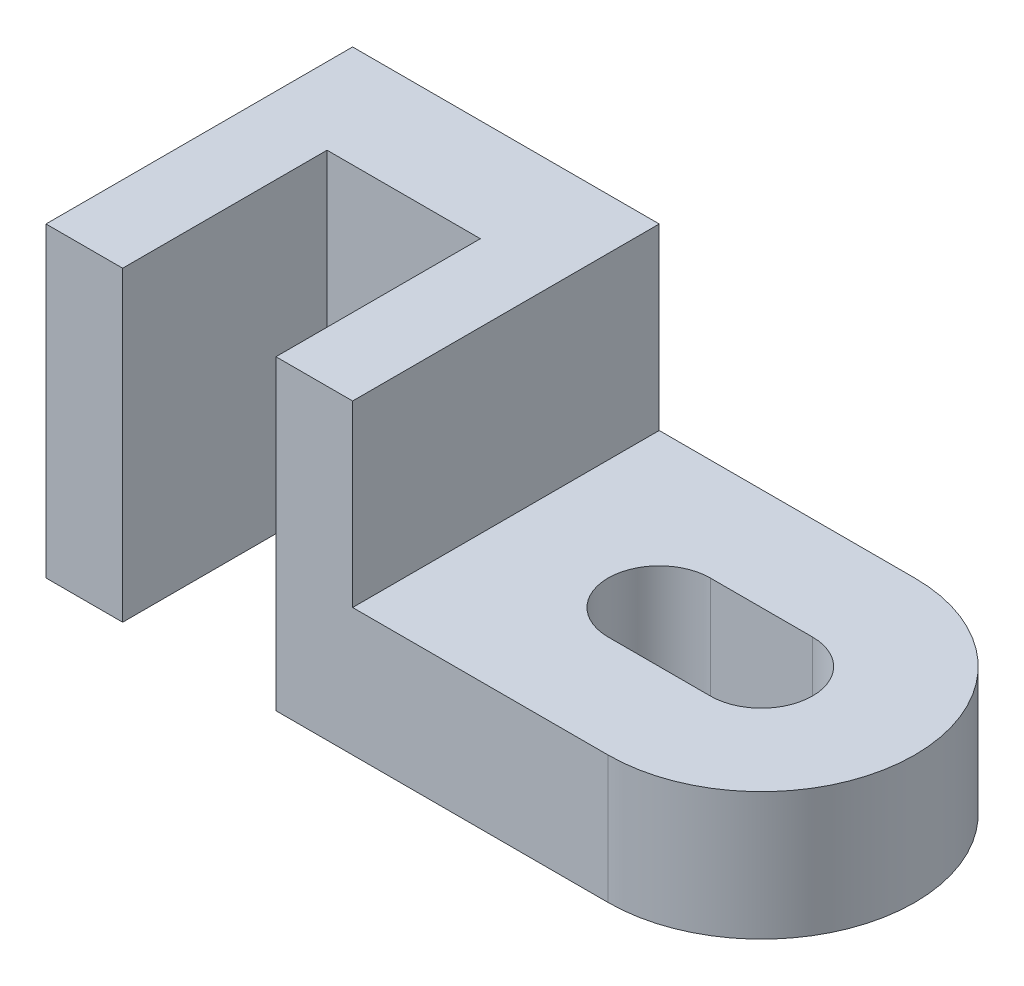
ISO-10303-21;
HEADER;
FILE_DESCRIPTION(('STEP AP214'),'2;1');
FILE_NAME('part.step','',(''),(''),'','','');
FILE_SCHEMA(('AUTOMOTIVE_DESIGN { 1 0 10303 214 1 1 1 1 }'));
ENDSEC;
DATA;
#1=APPLICATION_CONTEXT('core data for automotive mechanical design processes');
#2=APPLICATION_PROTOCOL_DEFINITION('international standard','automotive_design',2000,#1);
#3=PRODUCT_CONTEXT('',#1,'mechanical');
#4=PRODUCT('Part','Part','',(#3));
#5=PRODUCT_RELATED_PRODUCT_CATEGORY('part','',(#4));
#6=PRODUCT_DEFINITION_FORMATION('','',#4);
#7=PRODUCT_DEFINITION_CONTEXT('part definition',#1,'design');
#8=PRODUCT_DEFINITION('design','',#6,#7);
#9=PRODUCT_DEFINITION_SHAPE('','',#8);
#10=(LENGTH_UNIT() NAMED_UNIT(*) SI_UNIT(.MILLI.,.METRE.));
#11=(NAMED_UNIT(*) PLANE_ANGLE_UNIT() SI_UNIT($,.RADIAN.));
#12=(NAMED_UNIT(*) SI_UNIT($,.STERADIAN.) SOLID_ANGLE_UNIT());
#13=UNCERTAINTY_MEASURE_WITH_UNIT(LENGTH_MEASURE(1.E-05),#10,'distance_accuracy_value','');
#14=(GEOMETRIC_REPRESENTATION_CONTEXT(3) GLOBAL_UNCERTAINTY_ASSIGNED_CONTEXT((#13)) GLOBAL_UNIT_ASSIGNED_CONTEXT((#10,
#11,#12)) REPRESENTATION_CONTEXT('',''));
#15=CARTESIAN_POINT('',(0.,0.,0.));
#16=DIRECTION('',(0.,0.,1.));
#17=DIRECTION('',(1.,0.,0.));
#18=AXIS2_PLACEMENT_3D('',#15,#16,#17);
#19=CARTESIAN_POINT('',(0.,24.,-12.));
#20=DIRECTION('',(0.,0.,-1.));
#21=DIRECTION('',(-1.,0.,0.));
#22=AXIS2_PLACEMENT_3D('',#19,#20,#21);
#23=PLANE('',#22);
#24=DIRECTION('',(1.,0.,0.));
#25=VECTOR('',#24,1.);
#26=CARTESIAN_POINT('',(0.,0.,-12.));
#27=LINE('',#26,#25);
#28=CARTESIAN_POINT('',(-24.,0.,-12.));
#29=VERTEX_POINT('',#28);
#30=CARTESIAN_POINT('',(20.,0.,-12.));
#31=VERTEX_POINT('',#30);
#32=EDGE_CURVE('E136',#29,#31,#27,.T.);
#33=ORIENTED_EDGE('',*,*,#32,.F.);
#34=DIRECTION('',(0.,-1.,0.));
#35=VECTOR('',#34,1.);
#36=CARTESIAN_POINT('',(-24.,24.,-12.));
#37=LINE('',#36,#35);
#38=CARTESIAN_POINT('',(-24.,24.,-12.));
#39=VERTEX_POINT('',#38);
#40=EDGE_CURVE('E11',#39,#29,#37,.T.);
#41=ORIENTED_EDGE('',*,*,#40,.F.);
#42=DIRECTION('',(1.,0.,0.));
#43=VECTOR('',#42,1.);
#44=CARTESIAN_POINT('',(0.,24.,-12.));
#45=LINE('',#44,#43);
#46=CARTESIAN_POINT('',(0.,24.,-12.));
#47=VERTEX_POINT('',#46);
#48=EDGE_CURVE('E155',#39,#47,#45,.T.);
#49=ORIENTED_EDGE('',*,*,#48,.T.);
#50=DIRECTION('',(0.,-1.,0.));
#51=VECTOR('',#50,1.);
#52=CARTESIAN_POINT('',(0.,24.,-12.));
#53=LINE('',#52,#51);
#54=CARTESIAN_POINT('',(0.,10.,-12.));
#55=VERTEX_POINT('',#54);
#56=EDGE_CURVE('E58',#47,#55,#53,.T.);
#57=ORIENTED_EDGE('',*,*,#56,.T.);
#58=DIRECTION('',(1.,0.,0.));
#59=VECTOR('',#58,1.);
#60=CARTESIAN_POINT('',(0.,10.,-12.));
#61=LINE('',#60,#59);
#62=CARTESIAN_POINT('',(20.,10.,-12.));
#63=VERTEX_POINT('',#62);
#64=EDGE_CURVE('E230',#55,#63,#61,.T.);
#65=ORIENTED_EDGE('',*,*,#64,.T.);
#66=DIRECTION('',(0.,-1.,0.));
#67=VECTOR('',#66,1.);
#68=CARTESIAN_POINT('',(20.,10.,-12.));
#69=LINE('',#68,#67);
#70=EDGE_CURVE('E140',#63,#31,#69,.T.);
#71=ORIENTED_EDGE('',*,*,#70,.T.);
#72=EDGE_LOOP('',(#33,#41,#49,#57,#65,#71));
#73=FACE_BOUND('',#72,.T.);
#74=ADVANCED_FACE('F39',(#73),#23,.T.);
#75=CARTESIAN_POINT('',(-24.,24.,0.));
#76=DIRECTION('',(-1.,0.,0.));
#77=DIRECTION('',(0.,0.,1.));
#78=AXIS2_PLACEMENT_3D('',#75,#76,#77);
#79=PLANE('',#78);
#80=DIRECTION('',(0.,0.,-1.));
#81=VECTOR('',#80,1.);
#82=CARTESIAN_POINT('',(-24.,0.,0.));
#83=LINE('',#82,#81);
#84=CARTESIAN_POINT('',(-24.,0.,12.));
#85=VERTEX_POINT('',#84);
#86=EDGE_CURVE('E139',#85,#29,#83,.T.);
#87=ORIENTED_EDGE('',*,*,#86,.F.);
#88=DIRECTION('',(0.,-1.,0.));
#89=VECTOR('',#88,1.);
#90=CARTESIAN_POINT('',(-24.,24.,12.));
#91=LINE('',#90,#89);
#92=CARTESIAN_POINT('',(-24.,24.,12.));
#93=VERTEX_POINT('',#92);
#94=EDGE_CURVE('E46',#93,#85,#91,.T.);
#95=ORIENTED_EDGE('',*,*,#94,.F.);
#96=DIRECTION('',(0.,0.,-1.));
#97=VECTOR('',#96,1.);
#98=CARTESIAN_POINT('',(-24.,24.,0.));
#99=LINE('',#98,#97);
#100=EDGE_CURVE('E182',#93,#39,#99,.T.);
#101=ORIENTED_EDGE('',*,*,#100,.T.);
#102=ORIENTED_EDGE('',*,*,#40,.T.);
#103=EDGE_LOOP('',(#87,#95,#101,#102));
#104=FACE_BOUND('',#103,.T.);
#105=ADVANCED_FACE('F172',(#104),#79,.T.);
#106=CARTESIAN_POINT('',(0.,24.,12.));
#107=DIRECTION('',(0.,0.,1.));
#108=DIRECTION('',(1.,0.,0.));
#109=AXIS2_PLACEMENT_3D('',#106,#107,#108);
#110=PLANE('',#109);
#111=DIRECTION('',(-1.,0.,0.));
#112=VECTOR('',#111,1.);
#113=CARTESIAN_POINT('',(0.,0.,12.));
#114=LINE('',#113,#112);
#115=CARTESIAN_POINT('',(-18.,0.,12.));
#116=VERTEX_POINT('',#115);
#117=EDGE_CURVE('E143',#116,#85,#114,.T.);
#118=ORIENTED_EDGE('',*,*,#117,.F.);
#119=DIRECTION('',(0.,-1.,0.));
#120=VECTOR('',#119,1.);
#121=CARTESIAN_POINT('',(-18.,24.,12.));
#122=LINE('',#121,#120);
#123=CARTESIAN_POINT('',(-18.,24.,12.));
#124=VERTEX_POINT('',#123);
#125=EDGE_CURVE('E161',#124,#116,#122,.T.);
#126=ORIENTED_EDGE('',*,*,#125,.F.);
#127=DIRECTION('',(-1.,0.,0.));
#128=VECTOR('',#127,1.);
#129=CARTESIAN_POINT('',(0.,24.,12.));
#130=LINE('',#129,#128);
#131=EDGE_CURVE('E168',#124,#93,#130,.T.);
#132=ORIENTED_EDGE('',*,*,#131,.T.);
#133=ORIENTED_EDGE('',*,*,#94,.T.);
#134=EDGE_LOOP('',(#118,#126,#132,#133));
#135=FACE_BOUND('',#134,.T.);
#136=ADVANCED_FACE('F166',(#135),#110,.T.);
#137=CARTESIAN_POINT('',(-18.,24.,0.));
#138=DIRECTION('',(1.,0.,0.));
#139=DIRECTION('',(0.,0.,-1.));
#140=AXIS2_PLACEMENT_3D('',#137,#138,#139);
#141=PLANE('',#140);
#142=DIRECTION('',(0.,0.,1.));
#143=VECTOR('',#142,1.);
#144=CARTESIAN_POINT('',(-18.,0.,0.));
#145=LINE('',#144,#143);
#146=CARTESIAN_POINT('',(-18.,0.,-4.));
#147=VERTEX_POINT('',#146);
#148=EDGE_CURVE('E146',#147,#116,#145,.T.);
#149=ORIENTED_EDGE('',*,*,#148,.F.);
#150=DIRECTION('',(0.,-1.,0.));
#151=VECTOR('',#150,1.);
#152=CARTESIAN_POINT('',(-18.,24.,-4.));
#153=LINE('',#152,#151);
#154=CARTESIAN_POINT('',(-18.,24.,-4.));
#155=VERTEX_POINT('',#154);
#156=EDGE_CURVE('E159',#155,#147,#153,.T.);
#157=ORIENTED_EDGE('',*,*,#156,.F.);
#158=DIRECTION('',(0.,0.,1.));
#159=VECTOR('',#158,1.);
#160=CARTESIAN_POINT('',(-18.,24.,0.));
#161=LINE('',#160,#159);
#162=EDGE_CURVE('E181',#155,#124,#161,.T.);
#163=ORIENTED_EDGE('',*,*,#162,.T.);
#164=ORIENTED_EDGE('',*,*,#125,.T.);
#165=EDGE_LOOP('',(#149,#157,#163,#164));
#166=FACE_BOUND('',#165,.T.);
#167=ADVANCED_FACE('F179',(#166),#141,.T.);
#168=CARTESIAN_POINT('',(0.,24.,-4.00000000000001));
#169=DIRECTION('',(0.,0.,1.));
#170=DIRECTION('',(1.,0.,0.));
#171=AXIS2_PLACEMENT_3D('',#168,#169,#170);
#172=PLANE('',#171);
#173=DIRECTION('',(-1.,0.,0.));
#174=VECTOR('',#173,1.);
#175=CARTESIAN_POINT('',(0.,0.,-4.00000000000001));
#176=LINE('',#175,#174);
#177=CARTESIAN_POINT('',(-6.,0.,-4.00000000000001));
#178=VERTEX_POINT('',#177);
#179=EDGE_CURVE('E149',#178,#147,#176,.T.);
#180=ORIENTED_EDGE('',*,*,#179,.F.);
#181=DIRECTION('',(0.,-1.,0.));
#182=VECTOR('',#181,1.);
#183=CARTESIAN_POINT('',(-6.,24.,-4.00000000000001));
#184=LINE('',#183,#182);
#185=CARTESIAN_POINT('',(-6.,24.,-4.00000000000001));
#186=VERTEX_POINT('',#185);
#187=EDGE_CURVE('E116',#186,#178,#184,.T.);
#188=ORIENTED_EDGE('',*,*,#187,.F.);
#189=DIRECTION('',(-1.,0.,0.));
#190=VECTOR('',#189,1.);
#191=CARTESIAN_POINT('',(0.,24.,-4.00000000000001));
#192=LINE('',#191,#190);
#193=EDGE_CURVE('E127',#186,#155,#192,.T.);
#194=ORIENTED_EDGE('',*,*,#193,.T.);
#195=ORIENTED_EDGE('',*,*,#156,.T.);
#196=EDGE_LOOP('',(#180,#188,#194,#195));
#197=FACE_BOUND('',#196,.T.);
#198=ADVANCED_FACE('F188',(#197),#172,.T.);
#199=CARTESIAN_POINT('',(-6.,24.,0.));
#200=DIRECTION('',(-1.,0.,0.));
#201=DIRECTION('',(0.,0.,1.));
#202=AXIS2_PLACEMENT_3D('',#199,#200,#201);
#203=PLANE('',#202);
#204=DIRECTION('',(0.,0.,-1.));
#205=VECTOR('',#204,1.);
#206=CARTESIAN_POINT('',(-6.,0.,0.));
#207=LINE('',#206,#205);
#208=CARTESIAN_POINT('',(-6.,0.,12.));
#209=VERTEX_POINT('',#208);
#210=EDGE_CURVE('E114',#209,#178,#207,.T.);
#211=ORIENTED_EDGE('',*,*,#210,.F.);
#212=DIRECTION('',(0.,-1.,0.));
#213=VECTOR('',#212,1.);
#214=CARTESIAN_POINT('',(-6.,24.,12.));
#215=LINE('',#214,#213);
#216=CARTESIAN_POINT('',(-6.,24.,12.));
#217=VERTEX_POINT('',#216);
#218=EDGE_CURVE('E86',#217,#209,#215,.T.);
#219=ORIENTED_EDGE('',*,*,#218,.F.);
#220=DIRECTION('',(0.,0.,-1.));
#221=VECTOR('',#220,1.);
#222=CARTESIAN_POINT('',(-6.,24.,0.));
#223=LINE('',#222,#221);
#224=EDGE_CURVE('E112',#217,#186,#223,.T.);
#225=ORIENTED_EDGE('',*,*,#224,.T.);
#226=ORIENTED_EDGE('',*,*,#187,.T.);
#227=EDGE_LOOP('',(#211,#219,#225,#226));
#228=FACE_BOUND('',#227,.T.);
#229=ADVANCED_FACE('F111',(#228),#203,.T.);
#230=CARTESIAN_POINT('',(0.,24.,12.));
#231=DIRECTION('',(0.,0.,1.));
#232=DIRECTION('',(1.,0.,0.));
#233=AXIS2_PLACEMENT_3D('',#230,#231,#232);
#234=PLANE('',#233);
#235=DIRECTION('',(-1.,0.,0.));
#236=VECTOR('',#235,1.);
#237=CARTESIAN_POINT('',(0.,0.,12.));
#238=LINE('',#237,#236);
#239=CARTESIAN_POINT('',(20.,0.,12.));
#240=VERTEX_POINT('',#239);
#241=EDGE_CURVE('E153',#240,#209,#238,.T.);
#242=ORIENTED_EDGE('',*,*,#241,.F.);
#243=DIRECTION('',(0.,-1.,0.));
#244=VECTOR('',#243,1.);
#245=CARTESIAN_POINT('',(20.,10.,12.));
#246=LINE('',#245,#244);
#247=CARTESIAN_POINT('',(20.,10.,12.));
#248=VERTEX_POINT('',#247);
#249=EDGE_CURVE('E194',#248,#240,#246,.T.);
#250=ORIENTED_EDGE('',*,*,#249,.F.);
#251=DIRECTION('',(-1.,0.,0.));
#252=VECTOR('',#251,1.);
#253=CARTESIAN_POINT('',(0.,10.,12.));
#254=LINE('',#253,#252);
#255=CARTESIAN_POINT('',(0.,10.,12.));
#256=VERTEX_POINT('',#255);
#257=EDGE_CURVE('E218',#248,#256,#254,.T.);
#258=ORIENTED_EDGE('',*,*,#257,.T.);
#259=DIRECTION('',(0.,-1.,0.));
#260=VECTOR('',#259,1.);
#261=CARTESIAN_POINT('',(0.,24.,12.));
#262=LINE('',#261,#260);
#263=CARTESIAN_POINT('',(0.,24.,12.));
#264=VERTEX_POINT('',#263);
#265=EDGE_CURVE('E117',#264,#256,#262,.T.);
#266=ORIENTED_EDGE('',*,*,#265,.F.);
#267=DIRECTION('',(-1.,0.,0.));
#268=VECTOR('',#267,1.);
#269=CARTESIAN_POINT('',(0.,24.,12.));
#270=LINE('',#269,#268);
#271=EDGE_CURVE('E124',#264,#217,#270,.T.);
#272=ORIENTED_EDGE('',*,*,#271,.T.);
#273=ORIENTED_EDGE('',*,*,#218,.T.);
#274=EDGE_LOOP('',(#242,#250,#258,#266,#272,#273));
#275=FACE_BOUND('',#274,.T.);
#276=ADVANCED_FACE('F129',(#275),#234,.T.);
#277=CARTESIAN_POINT('',(0.,24.,0.));
#278=DIRECTION('',(1.,0.,0.));
#279=DIRECTION('',(0.,0.,-1.));
#280=AXIS2_PLACEMENT_3D('',#277,#278,#279);
#281=PLANE('',#280);
#282=DIRECTION('',(0.,0.,1.));
#283=VECTOR('',#282,1.);
#284=CARTESIAN_POINT('',(0.,10.,0.));
#285=LINE('',#284,#283);
#286=EDGE_CURVE('E53',#55,#256,#285,.T.);
#287=ORIENTED_EDGE('',*,*,#286,.F.);
#288=ORIENTED_EDGE('',*,*,#56,.F.);
#289=DIRECTION('',(0.,0.,1.));
#290=VECTOR('',#289,1.);
#291=CARTESIAN_POINT('',(0.,24.,0.));
#292=LINE('',#291,#290);
#293=EDGE_CURVE('E131',#47,#264,#292,.T.);
#294=ORIENTED_EDGE('',*,*,#293,.T.);
#295=ORIENTED_EDGE('',*,*,#265,.T.);
#296=EDGE_LOOP('',(#287,#288,#294,#295));
#297=FACE_BOUND('',#296,.T.);
#298=ADVANCED_FACE('F224',(#297),#281,.T.);
#299=CARTESIAN_POINT('',(0.,24.,0.));
#300=DIRECTION('',(0.,1.,0.));
#301=DIRECTION('',(0.,0.,1.));
#302=AXIS2_PLACEMENT_3D('',#299,#300,#301);
#303=PLANE('',#302);
#304=ORIENTED_EDGE('',*,*,#48,.F.);
#305=ORIENTED_EDGE('',*,*,#100,.F.);
#306=ORIENTED_EDGE('',*,*,#131,.F.);
#307=ORIENTED_EDGE('',*,*,#162,.F.);
#308=ORIENTED_EDGE('',*,*,#193,.F.);
#309=ORIENTED_EDGE('',*,*,#224,.F.);
#310=ORIENTED_EDGE('',*,*,#271,.F.);
#311=ORIENTED_EDGE('',*,*,#293,.F.);
#312=EDGE_LOOP('',(#304,#305,#306,#307,#308,#309,#310,#311));
#313=FACE_BOUND('',#312,.T.);
#314=ADVANCED_FACE('F122',(#313),#303,.T.);
#315=CARTESIAN_POINT('',(0.,0.,0.));
#316=DIRECTION('',(0.,1.,0.));
#317=DIRECTION('',(0.,0.,1.));
#318=AXIS2_PLACEMENT_3D('',#315,#316,#317);
#319=PLANE('',#318);
#320=ORIENTED_EDGE('',*,*,#32,.T.);
#321=CARTESIAN_POINT('',(20.,0.,0.));
#322=DIRECTION('',(0.,1.,0.));
#323=DIRECTION('',(0.,0.,1.));
#324=AXIS2_PLACEMENT_3D('',#321,#322,#323);
#325=CIRCLE('',#324,12.);
#326=EDGE_CURVE('E191',#31,#240,#325,.F.);
#327=ORIENTED_EDGE('',*,*,#326,.T.);
#328=ORIENTED_EDGE('',*,*,#241,.T.);
#329=ORIENTED_EDGE('',*,*,#210,.T.);
#330=ORIENTED_EDGE('',*,*,#179,.T.);
#331=ORIENTED_EDGE('',*,*,#148,.T.);
#332=ORIENTED_EDGE('',*,*,#117,.T.);
#333=ORIENTED_EDGE('',*,*,#86,.T.);
#334=EDGE_LOOP('',(#320,#327,#328,#329,#330,#331,#332,#333));
#335=FACE_BOUND('',#334,.T.);
#336=CARTESIAN_POINT('',(12.,0.,0.));
#337=DIRECTION('',(0.,1.,0.));
#338=DIRECTION('',(0.,0.,1.));
#339=AXIS2_PLACEMENT_3D('',#336,#337,#338);
#340=CIRCLE('',#339,4.);
#341=CARTESIAN_POINT('',(12.,0.,-4.));
#342=VERTEX_POINT('',#341);
#343=CARTESIAN_POINT('',(12.,0.,4.));
#344=VERTEX_POINT('',#343);
#345=EDGE_CURVE('E235',#342,#344,#340,.T.);
#346=ORIENTED_EDGE('',*,*,#345,.T.);
#347=DIRECTION('',(-1.,0.,0.));
#348=VECTOR('',#347,1.);
#349=CARTESIAN_POINT('',(0.,0.,4.));
#350=LINE('',#349,#348);
#351=CARTESIAN_POINT('',(20.,0.,4.));
#352=VERTEX_POINT('',#351);
#353=EDGE_CURVE('E243',#352,#344,#350,.T.);
#354=ORIENTED_EDGE('',*,*,#353,.F.);
#355=CARTESIAN_POINT('',(20.,0.,0.));
#356=DIRECTION('',(0.,1.,0.));
#357=DIRECTION('',(0.,0.,1.));
#358=AXIS2_PLACEMENT_3D('',#355,#356,#357);
#359=CIRCLE('',#358,4.);
#360=CARTESIAN_POINT('',(20.,0.,-4.));
#361=VERTEX_POINT('',#360);
#362=EDGE_CURVE('E241',#352,#361,#359,.T.);
#363=ORIENTED_EDGE('',*,*,#362,.T.);
#364=DIRECTION('',(-1.,0.,0.));
#365=VECTOR('',#364,1.);
#366=CARTESIAN_POINT('',(0.,0.,-3.99999999999999));
#367=LINE('',#366,#365);
#368=EDGE_CURVE('E238',#361,#342,#367,.T.);
#369=ORIENTED_EDGE('',*,*,#368,.T.);
#370=EDGE_LOOP('',(#346,#354,#363,#369));
#371=FACE_BOUND('',#370,.T.);
#372=ADVANCED_FACE('F174',(#335,#371),#319,.F.);
#373=CARTESIAN_POINT('',(20.,10.,0.));
#374=DIRECTION('',(0.,-1.,0.));
#375=DIRECTION('',(0.,0.,-1.));
#376=AXIS2_PLACEMENT_3D('',#373,#374,#375);
#377=CYLINDRICAL_SURFACE('',#376,12.);
#378=ORIENTED_EDGE('',*,*,#326,.F.);
#379=ORIENTED_EDGE('',*,*,#70,.F.);
#380=CARTESIAN_POINT('',(20.,10.,0.));
#381=DIRECTION('',(0.,1.,0.));
#382=DIRECTION('',(0.,0.,1.));
#383=AXIS2_PLACEMENT_3D('',#380,#381,#382);
#384=CIRCLE('',#383,12.);
#385=EDGE_CURVE('E202',#63,#248,#384,.F.);
#386=ORIENTED_EDGE('',*,*,#385,.T.);
#387=ORIENTED_EDGE('',*,*,#249,.T.);
#388=EDGE_LOOP('',(#378,#379,#386,#387));
#389=FACE_BOUND('',#388,.T.);
#390=ADVANCED_FACE('F199',(#389),#377,.T.);
#391=CARTESIAN_POINT('',(12.,10.,0.));
#392=DIRECTION('',(0.,-1.,0.));
#393=DIRECTION('',(0.,0.,-1.));
#394=AXIS2_PLACEMENT_3D('',#391,#392,#393);
#395=CYLINDRICAL_SURFACE('',#394,4.);
#396=ORIENTED_EDGE('',*,*,#345,.F.);
#397=DIRECTION('',(0.,-1.,0.));
#398=VECTOR('',#397,1.);
#399=CARTESIAN_POINT('',(12.,10.,-4.));
#400=LINE('',#399,#398);
#401=CARTESIAN_POINT('',(12.,10.,-4.));
#402=VERTEX_POINT('',#401);
#403=EDGE_CURVE('E204',#402,#342,#400,.T.);
#404=ORIENTED_EDGE('',*,*,#403,.F.);
#405=CARTESIAN_POINT('',(12.,10.,0.));
#406=DIRECTION('',(0.,1.,0.));
#407=DIRECTION('',(0.,0.,1.));
#408=AXIS2_PLACEMENT_3D('',#405,#406,#407);
#409=CIRCLE('',#408,4.);
#410=CARTESIAN_POINT('',(12.,10.,4.));
#411=VERTEX_POINT('',#410);
#412=EDGE_CURVE('E249',#402,#411,#409,.T.);
#413=ORIENTED_EDGE('',*,*,#412,.T.);
#414=DIRECTION('',(0.,-1.,0.));
#415=VECTOR('',#414,1.);
#416=CARTESIAN_POINT('',(12.,10.,4.));
#417=LINE('',#416,#415);
#418=EDGE_CURVE('E214',#411,#344,#417,.T.);
#419=ORIENTED_EDGE('',*,*,#418,.T.);
#420=EDGE_LOOP('',(#396,#404,#413,#419));
#421=FACE_BOUND('',#420,.T.);
#422=ADVANCED_FACE('F279',(#421),#395,.F.);
#423=CARTESIAN_POINT('',(0.,10.,-3.99999999999999));
#424=DIRECTION('',(0.,0.,1.));
#425=DIRECTION('',(1.,0.,0.));
#426=AXIS2_PLACEMENT_3D('',#423,#424,#425);
#427=PLANE('',#426);
#428=ORIENTED_EDGE('',*,*,#368,.F.);
#429=DIRECTION('',(0.,-1.,0.));
#430=VECTOR('',#429,1.);
#431=CARTESIAN_POINT('',(20.,10.,-4.));
#432=LINE('',#431,#430);
#433=CARTESIAN_POINT('',(20.,10.,-4.));
#434=VERTEX_POINT('',#433);
#435=EDGE_CURVE('E209',#434,#361,#432,.T.);
#436=ORIENTED_EDGE('',*,*,#435,.F.);
#437=DIRECTION('',(-1.,0.,0.));
#438=VECTOR('',#437,1.);
#439=CARTESIAN_POINT('',(0.,10.,-3.99999999999999));
#440=LINE('',#439,#438);
#441=EDGE_CURVE('E251',#434,#402,#440,.T.);
#442=ORIENTED_EDGE('',*,*,#441,.T.);
#443=ORIENTED_EDGE('',*,*,#403,.T.);
#444=EDGE_LOOP('',(#428,#436,#442,#443));
#445=FACE_BOUND('',#444,.T.);
#446=ADVANCED_FACE('F295',(#445),#427,.T.);
#447=CARTESIAN_POINT('',(20.,10.,0.));
#448=DIRECTION('',(0.,-1.,0.));
#449=DIRECTION('',(0.,0.,-1.));
#450=AXIS2_PLACEMENT_3D('',#447,#448,#449);
#451=CYLINDRICAL_SURFACE('',#450,4.);
#452=ORIENTED_EDGE('',*,*,#362,.F.);
#453=DIRECTION('',(0.,-1.,0.));
#454=VECTOR('',#453,1.);
#455=CARTESIAN_POINT('',(20.,10.,4.));
#456=LINE('',#455,#454);
#457=CARTESIAN_POINT('',(20.,10.,4.));
#458=VERTEX_POINT('',#457);
#459=EDGE_CURVE('E217',#458,#352,#456,.T.);
#460=ORIENTED_EDGE('',*,*,#459,.F.);
#461=CARTESIAN_POINT('',(20.,10.,0.));
#462=DIRECTION('',(0.,1.,0.));
#463=DIRECTION('',(0.,0.,1.));
#464=AXIS2_PLACEMENT_3D('',#461,#462,#463);
#465=CIRCLE('',#464,4.);
#466=EDGE_CURVE('E258',#458,#434,#465,.T.);
#467=ORIENTED_EDGE('',*,*,#466,.T.);
#468=ORIENTED_EDGE('',*,*,#435,.T.);
#469=EDGE_LOOP('',(#452,#460,#467,#468));
#470=FACE_BOUND('',#469,.T.);
#471=ADVANCED_FACE('F289',(#470),#451,.F.);
#472=CARTESIAN_POINT('',(0.,10.,4.));
#473=DIRECTION('',(0.,0.,1.));
#474=DIRECTION('',(1.,0.,0.));
#475=AXIS2_PLACEMENT_3D('',#472,#473,#474);
#476=PLANE('',#475);
#477=ORIENTED_EDGE('',*,*,#353,.T.);
#478=ORIENTED_EDGE('',*,*,#418,.F.);
#479=DIRECTION('',(-1.,0.,0.));
#480=VECTOR('',#479,1.);
#481=CARTESIAN_POINT('',(0.,10.,4.));
#482=LINE('',#481,#480);
#483=EDGE_CURVE('E263',#458,#411,#482,.T.);
#484=ORIENTED_EDGE('',*,*,#483,.F.);
#485=ORIENTED_EDGE('',*,*,#459,.T.);
#486=EDGE_LOOP('',(#477,#478,#484,#485));
#487=FACE_BOUND('',#486,.T.);
#488=ADVANCED_FACE('F281',(#487),#476,.F.);
#489=CARTESIAN_POINT('',(0.,10.,0.));
#490=DIRECTION('',(0.,1.,0.));
#491=DIRECTION('',(0.,0.,1.));
#492=AXIS2_PLACEMENT_3D('',#489,#490,#491);
#493=PLANE('',#492);
#494=ORIENTED_EDGE('',*,*,#412,.F.);
#495=ORIENTED_EDGE('',*,*,#441,.F.);
#496=ORIENTED_EDGE('',*,*,#466,.F.);
#497=ORIENTED_EDGE('',*,*,#483,.T.);
#498=EDGE_LOOP('',(#494,#495,#496,#497));
#499=FACE_BOUND('',#498,.T.);
#500=ORIENTED_EDGE('',*,*,#385,.F.);
#501=ORIENTED_EDGE('',*,*,#64,.F.);
#502=ORIENTED_EDGE('',*,*,#286,.T.);
#503=ORIENTED_EDGE('',*,*,#257,.F.);
#504=EDGE_LOOP('',(#500,#501,#502,#503));
#505=FACE_BOUND('',#504,.T.);
#506=ADVANCED_FACE('F229',(#499,#505),#493,.T.);
#507=CLOSED_SHELL('',(#74,#105,#136,#167,#198,#229,#276,#298,#314,#372,#390,#422,#446,#471,#488,#506));
#508=MANIFOLD_SOLID_BREP('B2',#507);
#509=ADVANCED_BREP_SHAPE_REPRESENTATION('',(#18,#508),#14);
#510=SHAPE_DEFINITION_REPRESENTATION(#9,#509);
ENDSEC;
END-ISO-10303-21;
